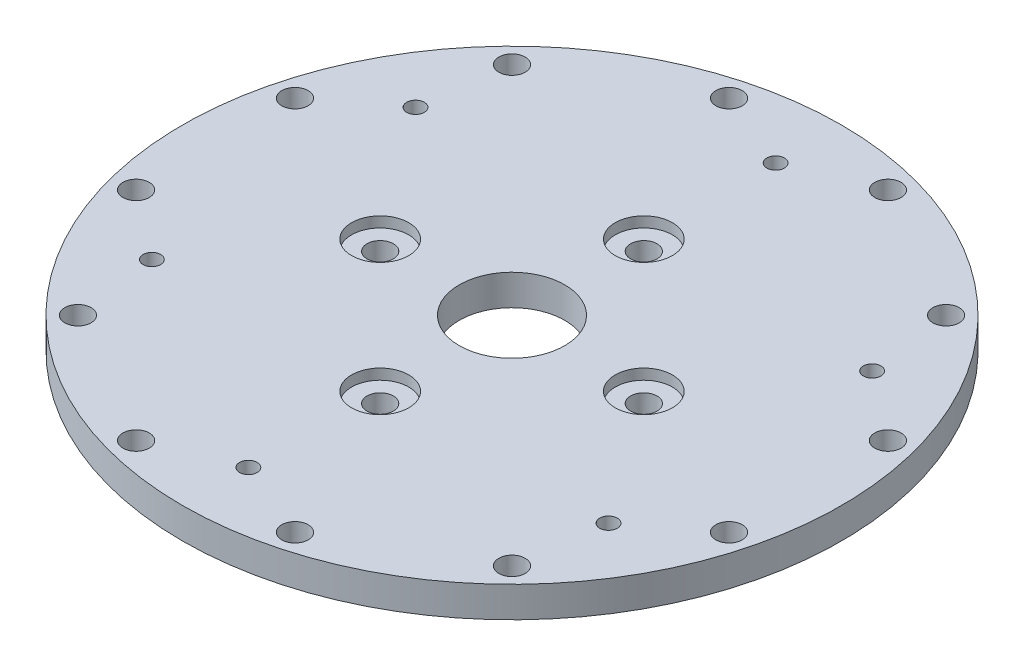
ISO-10303-21;
HEADER;
FILE_DESCRIPTION(('STEP AP214'),'2;1');
FILE_NAME('part.step','',(''),(''),'','','');
FILE_SCHEMA(('AUTOMOTIVE_DESIGN { 1 0 10303 214 1 1 1 1 }'));
ENDSEC;
DATA;
#1=APPLICATION_CONTEXT('core data for automotive mechanical design processes');
#2=APPLICATION_PROTOCOL_DEFINITION('international standard','automotive_design',2000,#1);
#3=PRODUCT_CONTEXT('',#1,'mechanical');
#4=PRODUCT('Part','Part','',(#3));
#5=PRODUCT_RELATED_PRODUCT_CATEGORY('part','',(#4));
#6=PRODUCT_DEFINITION_FORMATION('','',#4);
#7=PRODUCT_DEFINITION_CONTEXT('part definition',#1,'design');
#8=PRODUCT_DEFINITION('design','',#6,#7);
#9=PRODUCT_DEFINITION_SHAPE('','',#8);
#10=(LENGTH_UNIT() NAMED_UNIT(*) SI_UNIT(.MILLI.,.METRE.));
#11=(NAMED_UNIT(*) PLANE_ANGLE_UNIT() SI_UNIT($,.RADIAN.));
#12=(NAMED_UNIT(*) SI_UNIT($,.STERADIAN.) SOLID_ANGLE_UNIT());
#13=UNCERTAINTY_MEASURE_WITH_UNIT(LENGTH_MEASURE(1.E-05),#10,'distance_accuracy_value','');
#14=(GEOMETRIC_REPRESENTATION_CONTEXT(3) GLOBAL_UNCERTAINTY_ASSIGNED_CONTEXT((#13)) GLOBAL_UNIT_ASSIGNED_CONTEXT((#10,
#11,#12)) REPRESENTATION_CONTEXT('',''));
#15=CARTESIAN_POINT('',(0.,0.,0.));
#16=DIRECTION('',(0.,0.,1.));
#17=DIRECTION('',(1.,0.,0.));
#18=AXIS2_PLACEMENT_3D('',#15,#16,#17);
#19=CARTESIAN_POINT('',(0.,3.5,-14.9999999999999));
#20=DIRECTION('',(0.,-1.,0.));
#21=DIRECTION('',(0.,0.,-1.));
#22=AXIS2_PLACEMENT_3D('',#19,#20,#21);
#23=CYLINDRICAL_SURFACE('',#22,1.5);
#24=CARTESIAN_POINT('',(0.,0.,-14.9999999999999));
#25=DIRECTION('',(0.,1.,0.));
#26=DIRECTION('',(0.,0.,1.));
#27=AXIS2_PLACEMENT_3D('',#24,#25,#26);
#28=CIRCLE('',#27,1.5);
#29=CARTESIAN_POINT('',(0.,0.,-13.4999999999999));
#30=VERTEX_POINT('',#29);
#31=EDGE_CURVE('E184',#30,#30,#28,.T.);
#32=ORIENTED_EDGE('',*,*,#31,.F.);
#33=EDGE_LOOP('',(#32));
#34=FACE_BOUND('',#33,.T.);
#35=CARTESIAN_POINT('',(0.,2.3,-14.9999999999999));
#36=DIRECTION('',(0.,1.,0.));
#37=DIRECTION('',(0.,0.,1.));
#38=AXIS2_PLACEMENT_3D('',#35,#36,#37);
#39=CIRCLE('',#38,1.5);
#40=CARTESIAN_POINT('',(0.,2.3,-13.4999999999999));
#41=VERTEX_POINT('',#40);
#42=EDGE_CURVE('E35',#41,#41,#39,.T.);
#43=ORIENTED_EDGE('',*,*,#42,.T.);
#44=EDGE_LOOP('',(#43));
#45=FACE_BOUND('',#44,.T.);
#46=ADVANCED_FACE('F31',(#34,#45),#23,.F.);
#47=CARTESIAN_POINT('',(15.0000000000004,3.5,-5.21223548286541E-13));
#48=DIRECTION('',(0.,-1.,0.));
#49=DIRECTION('',(0.,0.,-1.));
#50=AXIS2_PLACEMENT_3D('',#47,#48,#49);
#51=CYLINDRICAL_SURFACE('',#50,1.5);
#52=CARTESIAN_POINT('',(15.0000000000004,0.,-5.21223548286541E-13));
#53=DIRECTION('',(0.,1.,0.));
#54=DIRECTION('',(0.,0.,1.));
#55=AXIS2_PLACEMENT_3D('',#52,#53,#54);
#56=CIRCLE('',#55,1.5);
#57=CARTESIAN_POINT('',(15.0000000000004,0.,1.49999999999948));
#58=VERTEX_POINT('',#57);
#59=EDGE_CURVE('E181',#58,#58,#56,.T.);
#60=ORIENTED_EDGE('',*,*,#59,.F.);
#61=EDGE_LOOP('',(#60));
#62=FACE_BOUND('',#61,.T.);
#63=CARTESIAN_POINT('',(15.0000000000004,2.3,-5.21223548286541E-13));
#64=DIRECTION('',(0.,1.,0.));
#65=DIRECTION('',(0.,0.,1.));
#66=AXIS2_PLACEMENT_3D('',#63,#64,#65);
#67=CIRCLE('',#66,1.5);
#68=CARTESIAN_POINT('',(15.0000000000004,2.3,1.49999999999948));
#69=VERTEX_POINT('',#68);
#70=EDGE_CURVE('E56',#69,#69,#67,.T.);
#71=ORIENTED_EDGE('',*,*,#70,.T.);
#72=EDGE_LOOP('',(#71));
#73=FACE_BOUND('',#72,.T.);
#74=ADVANCED_FACE('F210',(#62,#73),#51,.F.);
#75=CARTESIAN_POINT('',(9.84833787313913E-13,3.5,14.9999999999999));
#76=DIRECTION('',(0.,-1.,0.));
#77=DIRECTION('',(0.,0.,-1.));
#78=AXIS2_PLACEMENT_3D('',#75,#76,#77);
#79=CYLINDRICAL_SURFACE('',#78,1.5);
#80=CARTESIAN_POINT('',(9.84833787313913E-13,0.,14.9999999999999));
#81=DIRECTION('',(0.,1.,0.));
#82=DIRECTION('',(0.,0.,1.));
#83=AXIS2_PLACEMENT_3D('',#80,#81,#82);
#84=CIRCLE('',#83,1.5);
#85=CARTESIAN_POINT('',(9.84833787313913E-13,0.,16.4999999999999));
#86=VERTEX_POINT('',#85);
#87=EDGE_CURVE('E178',#86,#86,#84,.T.);
#88=ORIENTED_EDGE('',*,*,#87,.F.);
#89=EDGE_LOOP('',(#88));
#90=FACE_BOUND('',#89,.T.);
#91=CARTESIAN_POINT('',(9.84833787313913E-13,2.3,14.9999999999999));
#92=DIRECTION('',(0.,1.,0.));
#93=DIRECTION('',(0.,0.,1.));
#94=AXIS2_PLACEMENT_3D('',#91,#92,#93);
#95=CIRCLE('',#94,1.5);
#96=CARTESIAN_POINT('',(9.84833787313913E-13,2.3,16.4999999999999));
#97=VERTEX_POINT('',#96);
#98=EDGE_CURVE('E53',#97,#97,#95,.T.);
#99=ORIENTED_EDGE('',*,*,#98,.T.);
#100=EDGE_LOOP('',(#99));
#101=FACE_BOUND('',#100,.T.);
#102=ADVANCED_FACE('F215',(#90,#101),#79,.F.);
#103=CARTESIAN_POINT('',(-14.9999999999994,3.5,5.23060518485262E-13));
#104=DIRECTION('',(0.,-1.,0.));
#105=DIRECTION('',(0.,0.,-1.));
#106=AXIS2_PLACEMENT_3D('',#103,#104,#105);
#107=CYLINDRICAL_SURFACE('',#106,1.5);
#108=CARTESIAN_POINT('',(-14.9999999999994,0.,5.23060518485262E-13));
#109=DIRECTION('',(0.,1.,0.));
#110=DIRECTION('',(0.,0.,1.));
#111=AXIS2_PLACEMENT_3D('',#108,#109,#110);
#112=CIRCLE('',#111,1.5);
#113=CARTESIAN_POINT('',(-14.9999999999994,0.,1.50000000000052));
#114=VERTEX_POINT('',#113);
#115=EDGE_CURVE('E173',#114,#114,#112,.T.);
#116=ORIENTED_EDGE('',*,*,#115,.F.);
#117=EDGE_LOOP('',(#116));
#118=FACE_BOUND('',#117,.T.);
#119=CARTESIAN_POINT('',(-14.9999999999994,2.3,5.23060518485262E-13));
#120=DIRECTION('',(0.,1.,0.));
#121=DIRECTION('',(0.,0.,1.));
#122=AXIS2_PLACEMENT_3D('',#119,#120,#121);
#123=CIRCLE('',#122,1.5);
#124=CARTESIAN_POINT('',(-14.9999999999994,2.3,1.50000000000052));
#125=VERTEX_POINT('',#124);
#126=EDGE_CURVE('E50',#125,#125,#123,.T.);
#127=ORIENTED_EDGE('',*,*,#126,.T.);
#128=EDGE_LOOP('',(#127));
#129=FACE_BOUND('',#128,.T.);
#130=ADVANCED_FACE('F222',(#118,#129),#107,.F.);
#131=CARTESIAN_POINT('',(0.,3.5,0.));
#132=DIRECTION('',(0.,1.,0.));
#133=DIRECTION('',(0.,0.,1.));
#134=AXIS2_PLACEMENT_3D('',#131,#132,#133);
#135=PLANE('',#134);
#136=CARTESIAN_POINT('',(0.,3.5,-15.0000000000004));
#137=DIRECTION('',(0.,1.,0.));
#138=DIRECTION('',(0.,0.,1.));
#139=AXIS2_PLACEMENT_3D('',#136,#137,#138);
#140=CIRCLE('',#139,3.25);
#141=CARTESIAN_POINT('',(0.,3.5,-11.7500000000004));
#142=VERTEX_POINT('',#141);
#143=EDGE_CURVE('E331',#142,#142,#140,.T.);
#144=ORIENTED_EDGE('',*,*,#143,.F.);
#145=EDGE_LOOP('',(#144));
#146=FACE_BOUND('',#145,.T.);
#147=CARTESIAN_POINT('',(15.0000000000008,3.5,-4.23570186157989E-13));
#148=DIRECTION('',(0.,1.,0.));
#149=DIRECTION('',(0.,0.,1.));
#150=AXIS2_PLACEMENT_3D('',#147,#148,#149);
#151=CIRCLE('',#150,3.25);
#152=CARTESIAN_POINT('',(15.0000000000008,3.5,3.24999999999958));
#153=VERTEX_POINT('',#152);
#154=EDGE_CURVE('E339',#153,#153,#151,.T.);
#155=ORIENTED_EDGE('',*,*,#154,.F.);
#156=EDGE_LOOP('',(#155));
#157=FACE_BOUND('',#156,.T.);
#158=CARTESIAN_POINT('',(8.47140372315977E-13,3.5,15.0000000000004));
#159=DIRECTION('',(0.,1.,0.));
#160=DIRECTION('',(0.,0.,1.));
#161=AXIS2_PLACEMENT_3D('',#158,#159,#160);
#162=CIRCLE('',#161,3.25);
#163=CARTESIAN_POINT('',(8.47140372315977E-13,3.5,18.2500000000004));
#164=VERTEX_POINT('',#163);
#165=EDGE_CURVE('E345',#164,#164,#162,.T.);
#166=ORIENTED_EDGE('',*,*,#165,.F.);
#167=EDGE_LOOP('',(#166));
#168=FACE_BOUND('',#167,.T.);
#169=CARTESIAN_POINT('',(-14.9999999999999,3.5,4.2540715635671E-13));
#170=DIRECTION('',(0.,1.,0.));
#171=DIRECTION('',(0.,0.,1.));
#172=AXIS2_PLACEMENT_3D('',#169,#170,#171);
#173=CIRCLE('',#172,3.25);
#174=CARTESIAN_POINT('',(-14.9999999999999,3.5,3.25000000000043));
#175=VERTEX_POINT('',#174);
#176=EDGE_CURVE('E350',#175,#175,#173,.T.);
#177=ORIENTED_EDGE('',*,*,#176,.F.);
#178=EDGE_LOOP('',(#177));
#179=FACE_BOUND('',#178,.T.);
#180=CARTESIAN_POINT('',(-25.9807621135312,3.5,15.0000000000011));
#181=DIRECTION('',(0.,1.,0.));
#182=DIRECTION('',(0.,0.,1.));
#183=AXIS2_PLACEMENT_3D('',#180,#181,#182);
#184=CIRCLE('',#183,1.00000000000243);
#185=CARTESIAN_POINT('',(-25.9807621135312,3.5,16.0000000000035));
#186=VERTEX_POINT('',#185);
#187=EDGE_CURVE('E74',#186,#186,#184,.T.);
#188=ORIENTED_EDGE('',*,*,#187,.F.);
#189=EDGE_LOOP('',(#188));
#190=FACE_BOUND('',#189,.T.);
#191=CARTESIAN_POINT('',(25.9807621135351,3.5,14.9999999999989));
#192=DIRECTION('',(0.,1.,0.));
#193=DIRECTION('',(0.,0.,1.));
#194=AXIS2_PLACEMENT_3D('',#191,#192,#193);
#195=CIRCLE('',#194,1.00000000000165);
#196=CARTESIAN_POINT('',(25.9807621135351,3.5,16.0000000000005));
#197=VERTEX_POINT('',#196);
#198=EDGE_CURVE('E86',#197,#197,#195,.T.);
#199=ORIENTED_EDGE('',*,*,#198,.F.);
#200=EDGE_LOOP('',(#199));
#201=FACE_BOUND('',#200,.T.);
#202=CARTESIAN_POINT('',(-24.6972276961999,3.5,24.697227696199));
#203=DIRECTION('',(0.,1.,0.));
#204=DIRECTION('',(0.,0.,1.));
#205=AXIS2_PLACEMENT_3D('',#202,#203,#204);
#206=CIRCLE('',#205,1.50000000000001);
#207=CARTESIAN_POINT('',(-24.6972276961999,3.5,26.197227696199));
#208=VERTEX_POINT('',#207);
#209=EDGE_CURVE('E98',#208,#208,#206,.T.);
#210=ORIENTED_EDGE('',*,*,#209,.F.);
#211=EDGE_LOOP('',(#210));
#212=FACE_BOUND('',#211,.T.);
#213=CARTESIAN_POINT('',(9.03981273985704,3.5,33.7370404360572));
#214=DIRECTION('',(0.,1.,0.));
#215=DIRECTION('',(0.,0.,1.));
#216=AXIS2_PLACEMENT_3D('',#213,#214,#215);
#217=CIRCLE('',#216,1.50000000000001);
#218=CARTESIAN_POINT('',(9.03981273985704,3.5,35.2370404360572));
#219=VERTEX_POINT('',#218);
#220=EDGE_CURVE('E110',#219,#219,#217,.T.);
#221=ORIENTED_EDGE('',*,*,#220,.F.);
#222=EDGE_LOOP('',(#221));
#223=FACE_BOUND('',#222,.T.);
#224=CARTESIAN_POINT('',(33.7370404360569,3.5,9.03981273985811));
#225=DIRECTION('',(0.,1.,0.));
#226=DIRECTION('',(0.,0.,1.));
#227=AXIS2_PLACEMENT_3D('',#224,#225,#226);
#228=CIRCLE('',#227,1.5);
#229=CARTESIAN_POINT('',(33.7370404360569,3.5,10.5398127398581));
#230=VERTEX_POINT('',#229);
#231=EDGE_CURVE('E122',#230,#230,#228,.T.);
#232=ORIENTED_EDGE('',*,*,#231,.F.);
#233=EDGE_LOOP('',(#232));
#234=FACE_BOUND('',#233,.T.);
#235=CARTESIAN_POINT('',(24.6972276961997,3.5,-24.6972276961991));
#236=DIRECTION('',(0.,1.,0.));
#237=DIRECTION('',(0.,0.,1.));
#238=AXIS2_PLACEMENT_3D('',#235,#236,#237);
#239=CIRCLE('',#238,1.50000000000001);
#240=CARTESIAN_POINT('',(24.6972276961997,3.5,-23.1972276961991));
#241=VERTEX_POINT('',#240);
#242=EDGE_CURVE('E134',#241,#241,#239,.T.);
#243=ORIENTED_EDGE('',*,*,#242,.F.);
#244=EDGE_LOOP('',(#243));
#245=FACE_BOUND('',#244,.T.);
#246=CARTESIAN_POINT('',(-9.03981273985728,3.5,-33.7370404360571));
#247=DIRECTION('',(0.,1.,0.));
#248=DIRECTION('',(0.,0.,1.));
#249=AXIS2_PLACEMENT_3D('',#246,#247,#248);
#250=CIRCLE('',#249,1.50000000000001);
#251=CARTESIAN_POINT('',(-9.03981273985728,3.5,-32.2370404360571));
#252=VERTEX_POINT('',#251);
#253=EDGE_CURVE('E146',#252,#252,#250,.T.);
#254=ORIENTED_EDGE('',*,*,#253,.F.);
#255=EDGE_LOOP('',(#254));
#256=FACE_BOUND('',#255,.T.);
#257=CARTESIAN_POINT('',(-33.737040436057,3.5,-9.03981273985787));
#258=DIRECTION('',(0.,1.,0.));
#259=DIRECTION('',(0.,0.,1.));
#260=AXIS2_PLACEMENT_3D('',#257,#258,#259);
#261=CIRCLE('',#260,1.50000000000001);
#262=CARTESIAN_POINT('',(-33.737040436057,3.5,-7.53981273985786));
#263=VERTEX_POINT('',#262);
#264=EDGE_CURVE('E158',#263,#263,#261,.T.);
#265=ORIENTED_EDGE('',*,*,#264,.F.);
#266=EDGE_LOOP('',(#265));
#267=FACE_BOUND('',#266,.T.);
#268=CARTESIAN_POINT('',(-33.7370404360571,3.5,9.0398127398574));
#269=DIRECTION('',(0.,1.,0.));
#270=DIRECTION('',(0.,0.,1.));
#271=AXIS2_PLACEMENT_3D('',#268,#269,#270);
#272=CIRCLE('',#271,1.5);
#273=CARTESIAN_POINT('',(-33.7370404360571,3.5,10.5398127398574));
#274=VERTEX_POINT('',#273);
#275=EDGE_CURVE('E170',#274,#274,#272,.T.);
#276=ORIENTED_EDGE('',*,*,#275,.F.);
#277=EDGE_LOOP('',(#276));
#278=FACE_BOUND('',#277,.T.);
#279=CARTESIAN_POINT('',(0.,3.5,0.));
#280=DIRECTION('',(0.,1.,0.));
#281=DIRECTION('',(0.,0.,1.));
#282=AXIS2_PLACEMENT_3D('',#279,#280,#281);
#283=CIRCLE('',#282,37.5);
#284=CARTESIAN_POINT('',(0.,3.5,37.5));
#285=VERTEX_POINT('',#284);
#286=EDGE_CURVE('E10',#285,#285,#283,.T.);
#287=ORIENTED_EDGE('',*,*,#286,.T.);
#288=EDGE_LOOP('',(#287));
#289=FACE_BOUND('',#288,.T.);
#290=CARTESIAN_POINT('',(0.,3.5,0.));
#291=DIRECTION('',(0.,1.,0.));
#292=DIRECTION('',(0.,0.,1.));
#293=AXIS2_PLACEMENT_3D('',#290,#291,#292);
#294=CIRCLE('',#293,6.);
#295=CARTESIAN_POINT('',(0.,3.5,6.));
#296=VERTEX_POINT('',#295);
#297=EDGE_CURVE('E44',#296,#296,#294,.T.);
#298=ORIENTED_EDGE('',*,*,#297,.F.);
#299=EDGE_LOOP('',(#298));
#300=FACE_BOUND('',#299,.T.);
#301=CARTESIAN_POINT('',(0.,3.5,-30.));
#302=DIRECTION('',(0.,1.,0.));
#303=DIRECTION('',(0.,0.,1.));
#304=AXIS2_PLACEMENT_3D('',#301,#302,#303);
#305=CIRCLE('',#304,1.);
#306=CARTESIAN_POINT('',(0.,3.5,-29.));
#307=VERTEX_POINT('',#306);
#308=EDGE_CURVE('E164',#307,#307,#305,.T.);
#309=ORIENTED_EDGE('',*,*,#308,.F.);
#310=EDGE_LOOP('',(#309));
#311=FACE_BOUND('',#310,.T.);
#312=CARTESIAN_POINT('',(-24.6972276961992,3.5,-24.6972276961996));
#313=DIRECTION('',(0.,1.,0.));
#314=DIRECTION('',(0.,0.,1.));
#315=AXIS2_PLACEMENT_3D('',#312,#313,#314);
#316=CIRCLE('',#315,1.5);
#317=CARTESIAN_POINT('',(-24.6972276961992,3.5,-23.1972276961996));
#318=VERTEX_POINT('',#317);
#319=EDGE_CURVE('E152',#318,#318,#316,.T.);
#320=ORIENTED_EDGE('',*,*,#319,.F.);
#321=EDGE_LOOP('',(#320));
#322=FACE_BOUND('',#321,.T.);
#323=CARTESIAN_POINT('',(9.03981273985798,3.5,-33.7370404360569));
#324=DIRECTION('',(0.,1.,0.));
#325=DIRECTION('',(0.,0.,1.));
#326=AXIS2_PLACEMENT_3D('',#323,#324,#325);
#327=CIRCLE('',#326,1.5);
#328=CARTESIAN_POINT('',(9.03981273985798,3.5,-32.2370404360569));
#329=VERTEX_POINT('',#328);
#330=EDGE_CURVE('E140',#329,#329,#327,.T.);
#331=ORIENTED_EDGE('',*,*,#330,.F.);
#332=EDGE_LOOP('',(#331));
#333=FACE_BOUND('',#332,.T.);
#334=CARTESIAN_POINT('',(33.7370404360572,3.5,-9.03981273985717));
#335=DIRECTION('',(0.,1.,0.));
#336=DIRECTION('',(0.,0.,1.));
#337=AXIS2_PLACEMENT_3D('',#334,#335,#336);
#338=CIRCLE('',#337,1.5);
#339=CARTESIAN_POINT('',(33.7370404360572,3.5,-7.53981273985716));
#340=VERTEX_POINT('',#339);
#341=EDGE_CURVE('E128',#340,#340,#338,.T.);
#342=ORIENTED_EDGE('',*,*,#341,.F.);
#343=EDGE_LOOP('',(#342));
#344=FACE_BOUND('',#343,.T.);
#345=CARTESIAN_POINT('',(24.697227696199,3.5,24.6972276961998));
#346=DIRECTION('',(0.,1.,0.));
#347=DIRECTION('',(0.,0.,1.));
#348=AXIS2_PLACEMENT_3D('',#345,#346,#347);
#349=CIRCLE('',#348,1.5);
#350=CARTESIAN_POINT('',(24.697227696199,3.5,26.1972276961998));
#351=VERTEX_POINT('',#350);
#352=EDGE_CURVE('E116',#351,#351,#349,.T.);
#353=ORIENTED_EDGE('',*,*,#352,.F.);
#354=EDGE_LOOP('',(#353));
#355=FACE_BOUND('',#354,.T.);
#356=CARTESIAN_POINT('',(-9.03981273985821,3.5,33.7370404360569));
#357=DIRECTION('',(0.,1.,0.));
#358=DIRECTION('',(0.,0.,1.));
#359=AXIS2_PLACEMENT_3D('',#356,#357,#358);
#360=CIRCLE('',#359,1.5);
#361=CARTESIAN_POINT('',(-9.03981273985821,3.5,35.2370404360569));
#362=VERTEX_POINT('',#361);
#363=EDGE_CURVE('E104',#362,#362,#360,.T.);
#364=ORIENTED_EDGE('',*,*,#363,.F.);
#365=EDGE_LOOP('',(#364));
#366=FACE_BOUND('',#365,.T.);
#367=CARTESIAN_POINT('',(25.9807621135338,3.5,-15.0000000000011));
#368=DIRECTION('',(0.,1.,0.));
#369=DIRECTION('',(0.,0.,1.));
#370=AXIS2_PLACEMENT_3D('',#367,#368,#369);
#371=CIRCLE('',#370,1.00000000000036);
#372=CARTESIAN_POINT('',(25.9807621135338,3.5,-14.0000000000007));
#373=VERTEX_POINT('',#372);
#374=EDGE_CURVE('E92',#373,#373,#371,.T.);
#375=ORIENTED_EDGE('',*,*,#374,.F.);
#376=EDGE_LOOP('',(#375));
#377=FACE_BOUND('',#376,.T.);
#378=CARTESIAN_POINT('',(2.54693202754403E-12,3.5,30.));
#379=DIRECTION('',(0.,1.,0.));
#380=DIRECTION('',(0.,0.,1.));
#381=AXIS2_PLACEMENT_3D('',#378,#379,#380);
#382=CIRCLE('',#381,1.00000000000264);
#383=CARTESIAN_POINT('',(2.54693202754403E-12,3.5,31.0000000000026));
#384=VERTEX_POINT('',#383);
#385=EDGE_CURVE('E80',#384,#384,#382,.T.);
#386=ORIENTED_EDGE('',*,*,#385,.F.);
#387=EDGE_LOOP('',(#386));
#388=FACE_BOUND('',#387,.T.);
#389=CARTESIAN_POINT('',(-25.9807621135325,3.5,-14.9999999999989));
#390=DIRECTION('',(0.,1.,0.));
#391=DIRECTION('',(0.,0.,1.));
#392=AXIS2_PLACEMENT_3D('',#389,#390,#391);
#393=CIRCLE('',#392,1.00000000000129);
#394=CARTESIAN_POINT('',(-25.9807621135325,3.5,-13.9999999999976));
#395=VERTEX_POINT('',#394);
#396=EDGE_CURVE('E65',#395,#395,#393,.T.);
#397=ORIENTED_EDGE('',*,*,#396,.F.);
#398=EDGE_LOOP('',(#397));
#399=FACE_BOUND('',#398,.T.);
#400=ADVANCED_FACE('F225',(#146,#157,#168,#179,#190,#201,#212,#223,#234,#245,#256,#267,#278,
#289,#300,#311,#322,#333,#344,#355,#366,#377,#388,#399),#135,.T.);
#401=CARTESIAN_POINT('',(0.,0.,0.));
#402=DIRECTION('',(0.,1.,0.));
#403=DIRECTION('',(0.,0.,1.));
#404=AXIS2_PLACEMENT_3D('',#401,#402,#403);
#405=PLANE('',#404);
#406=CARTESIAN_POINT('',(0.,0.,0.));
#407=DIRECTION('',(0.,1.,0.));
#408=DIRECTION('',(0.,0.,1.));
#409=AXIS2_PLACEMENT_3D('',#406,#407,#408);
#410=CIRCLE('',#409,37.5);
#411=CARTESIAN_POINT('',(0.,0.,37.5));
#412=VERTEX_POINT('',#411);
#413=EDGE_CURVE('E39',#412,#412,#410,.T.);
#414=ORIENTED_EDGE('',*,*,#413,.F.);
#415=EDGE_LOOP('',(#414));
#416=FACE_BOUND('',#415,.T.);
#417=CARTESIAN_POINT('',(0.,0.,0.));
#418=DIRECTION('',(0.,1.,0.));
#419=DIRECTION('',(0.,0.,1.));
#420=AXIS2_PLACEMENT_3D('',#417,#418,#419);
#421=CIRCLE('',#420,6.);
#422=CARTESIAN_POINT('',(0.,0.,6.));
#423=VERTEX_POINT('',#422);
#424=EDGE_CURVE('E47',#423,#423,#421,.T.);
#425=ORIENTED_EDGE('',*,*,#424,.T.);
#426=EDGE_LOOP('',(#425));
#427=FACE_BOUND('',#426,.T.);
#428=ORIENTED_EDGE('',*,*,#31,.T.);
#429=EDGE_LOOP('',(#428));
#430=FACE_BOUND('',#429,.T.);
#431=ORIENTED_EDGE('',*,*,#59,.T.);
#432=EDGE_LOOP('',(#431));
#433=FACE_BOUND('',#432,.T.);
#434=ORIENTED_EDGE('',*,*,#87,.T.);
#435=EDGE_LOOP('',(#434));
#436=FACE_BOUND('',#435,.T.);
#437=ORIENTED_EDGE('',*,*,#115,.T.);
#438=EDGE_LOOP('',(#437));
#439=FACE_BOUND('',#438,.T.);
#440=CARTESIAN_POINT('',(-33.7370404360571,0.,9.0398127398574));
#441=DIRECTION('',(0.,1.,0.));
#442=DIRECTION('',(0.,0.,1.));
#443=AXIS2_PLACEMENT_3D('',#440,#441,#442);
#444=CIRCLE('',#443,1.5);
#445=CARTESIAN_POINT('',(-33.7370404360571,0.,10.5398127398574));
#446=VERTEX_POINT('',#445);
#447=EDGE_CURVE('E167',#446,#446,#444,.T.);
#448=ORIENTED_EDGE('',*,*,#447,.T.);
#449=EDGE_LOOP('',(#448));
#450=FACE_BOUND('',#449,.T.);
#451=CARTESIAN_POINT('',(0.,0.,-30.));
#452=DIRECTION('',(0.,1.,0.));
#453=DIRECTION('',(0.,0.,1.));
#454=AXIS2_PLACEMENT_3D('',#451,#452,#453);
#455=CIRCLE('',#454,1.);
#456=CARTESIAN_POINT('',(0.,0.,-29.));
#457=VERTEX_POINT('',#456);
#458=EDGE_CURVE('E161',#457,#457,#455,.T.);
#459=ORIENTED_EDGE('',*,*,#458,.T.);
#460=EDGE_LOOP('',(#459));
#461=FACE_BOUND('',#460,.T.);
#462=CARTESIAN_POINT('',(-33.737040436057,0.,-9.03981273985787));
#463=DIRECTION('',(0.,1.,0.));
#464=DIRECTION('',(0.,0.,1.));
#465=AXIS2_PLACEMENT_3D('',#462,#463,#464);
#466=CIRCLE('',#465,1.50000000000001);
#467=CARTESIAN_POINT('',(-33.737040436057,0.,-7.53981273985786));
#468=VERTEX_POINT('',#467);
#469=EDGE_CURVE('E155',#468,#468,#466,.T.);
#470=ORIENTED_EDGE('',*,*,#469,.T.);
#471=EDGE_LOOP('',(#470));
#472=FACE_BOUND('',#471,.T.);
#473=CARTESIAN_POINT('',(-24.6972276961992,0.,-24.6972276961996));
#474=DIRECTION('',(0.,1.,0.));
#475=DIRECTION('',(0.,0.,1.));
#476=AXIS2_PLACEMENT_3D('',#473,#474,#475);
#477=CIRCLE('',#476,1.5);
#478=CARTESIAN_POINT('',(-24.6972276961992,0.,-23.1972276961996));
#479=VERTEX_POINT('',#478);
#480=EDGE_CURVE('E149',#479,#479,#477,.T.);
#481=ORIENTED_EDGE('',*,*,#480,.T.);
#482=EDGE_LOOP('',(#481));
#483=FACE_BOUND('',#482,.T.);
#484=CARTESIAN_POINT('',(-9.03981273985728,0.,-33.7370404360571));
#485=DIRECTION('',(0.,1.,0.));
#486=DIRECTION('',(0.,0.,1.));
#487=AXIS2_PLACEMENT_3D('',#484,#485,#486);
#488=CIRCLE('',#487,1.50000000000001);
#489=CARTESIAN_POINT('',(-9.03981273985728,0.,-32.2370404360571));
#490=VERTEX_POINT('',#489);
#491=EDGE_CURVE('E143',#490,#490,#488,.T.);
#492=ORIENTED_EDGE('',*,*,#491,.T.);
#493=EDGE_LOOP('',(#492));
#494=FACE_BOUND('',#493,.T.);
#495=CARTESIAN_POINT('',(9.03981273985798,0.,-33.7370404360569));
#496=DIRECTION('',(0.,1.,0.));
#497=DIRECTION('',(0.,0.,1.));
#498=AXIS2_PLACEMENT_3D('',#495,#496,#497);
#499=CIRCLE('',#498,1.5);
#500=CARTESIAN_POINT('',(9.03981273985798,0.,-32.2370404360569));
#501=VERTEX_POINT('',#500);
#502=EDGE_CURVE('E137',#501,#501,#499,.T.);
#503=ORIENTED_EDGE('',*,*,#502,.T.);
#504=EDGE_LOOP('',(#503));
#505=FACE_BOUND('',#504,.T.);
#506=CARTESIAN_POINT('',(24.6972276961997,0.,-24.6972276961991));
#507=DIRECTION('',(0.,1.,0.));
#508=DIRECTION('',(0.,0.,1.));
#509=AXIS2_PLACEMENT_3D('',#506,#507,#508);
#510=CIRCLE('',#509,1.50000000000001);
#511=CARTESIAN_POINT('',(24.6972276961997,0.,-23.1972276961991));
#512=VERTEX_POINT('',#511);
#513=EDGE_CURVE('E131',#512,#512,#510,.T.);
#514=ORIENTED_EDGE('',*,*,#513,.T.);
#515=EDGE_LOOP('',(#514));
#516=FACE_BOUND('',#515,.T.);
#517=CARTESIAN_POINT('',(33.7370404360572,0.,-9.03981273985717));
#518=DIRECTION('',(0.,1.,0.));
#519=DIRECTION('',(0.,0.,1.));
#520=AXIS2_PLACEMENT_3D('',#517,#518,#519);
#521=CIRCLE('',#520,1.5);
#522=CARTESIAN_POINT('',(33.7370404360572,0.,-7.53981273985716));
#523=VERTEX_POINT('',#522);
#524=EDGE_CURVE('E125',#523,#523,#521,.T.);
#525=ORIENTED_EDGE('',*,*,#524,.T.);
#526=EDGE_LOOP('',(#525));
#527=FACE_BOUND('',#526,.T.);
#528=CARTESIAN_POINT('',(33.7370404360569,0.,9.03981273985811));
#529=DIRECTION('',(0.,1.,0.));
#530=DIRECTION('',(0.,0.,1.));
#531=AXIS2_PLACEMENT_3D('',#528,#529,#530);
#532=CIRCLE('',#531,1.5);
#533=CARTESIAN_POINT('',(33.7370404360569,0.,10.5398127398581));
#534=VERTEX_POINT('',#533);
#535=EDGE_CURVE('E119',#534,#534,#532,.T.);
#536=ORIENTED_EDGE('',*,*,#535,.T.);
#537=EDGE_LOOP('',(#536));
#538=FACE_BOUND('',#537,.T.);
#539=CARTESIAN_POINT('',(24.697227696199,0.,24.6972276961998));
#540=DIRECTION('',(0.,1.,0.));
#541=DIRECTION('',(0.,0.,1.));
#542=AXIS2_PLACEMENT_3D('',#539,#540,#541);
#543=CIRCLE('',#542,1.5);
#544=CARTESIAN_POINT('',(24.697227696199,0.,26.1972276961998));
#545=VERTEX_POINT('',#544);
#546=EDGE_CURVE('E113',#545,#545,#543,.T.);
#547=ORIENTED_EDGE('',*,*,#546,.T.);
#548=EDGE_LOOP('',(#547));
#549=FACE_BOUND('',#548,.T.);
#550=CARTESIAN_POINT('',(9.03981273985704,0.,33.7370404360572));
#551=DIRECTION('',(0.,1.,0.));
#552=DIRECTION('',(0.,0.,1.));
#553=AXIS2_PLACEMENT_3D('',#550,#551,#552);
#554=CIRCLE('',#553,1.50000000000001);
#555=CARTESIAN_POINT('',(9.03981273985704,0.,35.2370404360572));
#556=VERTEX_POINT('',#555);
#557=EDGE_CURVE('E107',#556,#556,#554,.T.);
#558=ORIENTED_EDGE('',*,*,#557,.T.);
#559=EDGE_LOOP('',(#558));
#560=FACE_BOUND('',#559,.T.);
#561=CARTESIAN_POINT('',(-9.03981273985821,0.,33.7370404360569));
#562=DIRECTION('',(0.,1.,0.));
#563=DIRECTION('',(0.,0.,1.));
#564=AXIS2_PLACEMENT_3D('',#561,#562,#563);
#565=CIRCLE('',#564,1.5);
#566=CARTESIAN_POINT('',(-9.03981273985821,0.,35.2370404360569));
#567=VERTEX_POINT('',#566);
#568=EDGE_CURVE('E101',#567,#567,#565,.T.);
#569=ORIENTED_EDGE('',*,*,#568,.T.);
#570=EDGE_LOOP('',(#569));
#571=FACE_BOUND('',#570,.T.);
#572=CARTESIAN_POINT('',(-24.6972276961999,0.,24.697227696199));
#573=DIRECTION('',(0.,1.,0.));
#574=DIRECTION('',(0.,0.,1.));
#575=AXIS2_PLACEMENT_3D('',#572,#573,#574);
#576=CIRCLE('',#575,1.50000000000001);
#577=CARTESIAN_POINT('',(-24.6972276961999,0.,26.197227696199));
#578=VERTEX_POINT('',#577);
#579=EDGE_CURVE('E95',#578,#578,#576,.T.);
#580=ORIENTED_EDGE('',*,*,#579,.T.);
#581=EDGE_LOOP('',(#580));
#582=FACE_BOUND('',#581,.T.);
#583=CARTESIAN_POINT('',(25.9807621135338,0.,-15.0000000000011));
#584=DIRECTION('',(0.,1.,0.));
#585=DIRECTION('',(0.,0.,1.));
#586=AXIS2_PLACEMENT_3D('',#583,#584,#585);
#587=CIRCLE('',#586,1.00000000000036);
#588=CARTESIAN_POINT('',(25.9807621135338,0.,-14.0000000000007));
#589=VERTEX_POINT('',#588);
#590=EDGE_CURVE('E89',#589,#589,#587,.T.);
#591=ORIENTED_EDGE('',*,*,#590,.T.);
#592=EDGE_LOOP('',(#591));
#593=FACE_BOUND('',#592,.T.);
#594=CARTESIAN_POINT('',(25.9807621135351,0.,14.9999999999989));
#595=DIRECTION('',(0.,1.,0.));
#596=DIRECTION('',(0.,0.,1.));
#597=AXIS2_PLACEMENT_3D('',#594,#595,#596);
#598=CIRCLE('',#597,1.00000000000165);
#599=CARTESIAN_POINT('',(25.9807621135351,0.,16.0000000000005));
#600=VERTEX_POINT('',#599);
#601=EDGE_CURVE('E83',#600,#600,#598,.T.);
#602=ORIENTED_EDGE('',*,*,#601,.T.);
#603=EDGE_LOOP('',(#602));
#604=FACE_BOUND('',#603,.T.);
#605=CARTESIAN_POINT('',(2.54693202754403E-12,0.,30.));
#606=DIRECTION('',(0.,1.,0.));
#607=DIRECTION('',(0.,0.,1.));
#608=AXIS2_PLACEMENT_3D('',#605,#606,#607);
#609=CIRCLE('',#608,1.00000000000264);
#610=CARTESIAN_POINT('',(2.54693202754403E-12,0.,31.0000000000026));
#611=VERTEX_POINT('',#610);
#612=EDGE_CURVE('E77',#611,#611,#609,.T.);
#613=ORIENTED_EDGE('',*,*,#612,.T.);
#614=EDGE_LOOP('',(#613));
#615=FACE_BOUND('',#614,.T.);
#616=CARTESIAN_POINT('',(-25.9807621135312,0.,15.0000000000011));
#617=DIRECTION('',(0.,1.,0.));
#618=DIRECTION('',(0.,0.,1.));
#619=AXIS2_PLACEMENT_3D('',#616,#617,#618);
#620=CIRCLE('',#619,1.00000000000243);
#621=CARTESIAN_POINT('',(-25.9807621135312,0.,16.0000000000035));
#622=VERTEX_POINT('',#621);
#623=EDGE_CURVE('E70',#622,#622,#620,.T.);
#624=ORIENTED_EDGE('',*,*,#623,.T.);
#625=EDGE_LOOP('',(#624));
#626=FACE_BOUND('',#625,.T.);
#627=CARTESIAN_POINT('',(-25.9807621135325,0.,-14.9999999999989));
#628=DIRECTION('',(0.,1.,0.));
#629=DIRECTION('',(0.,0.,1.));
#630=AXIS2_PLACEMENT_3D('',#627,#628,#629);
#631=CIRCLE('',#630,1.00000000000129);
#632=CARTESIAN_POINT('',(-25.9807621135325,0.,-13.9999999999976));
#633=VERTEX_POINT('',#632);
#634=EDGE_CURVE('E61',#633,#633,#631,.T.);
#635=ORIENTED_EDGE('',*,*,#634,.T.);
#636=EDGE_LOOP('',(#635));
#637=FACE_BOUND('',#636,.T.);
#638=ADVANCED_FACE('F192',(#416,#427,#430,#433,#436,#439,#450,#461,#472,#483,#494,#505,#516,
#527,#538,#549,#560,#571,#582,#593,#604,#615,#626,#637),#405,.F.);
#639=CARTESIAN_POINT('',(0.,3.5,0.));
#640=DIRECTION('',(0.,-1.,0.));
#641=DIRECTION('',(0.,0.,-1.));
#642=AXIS2_PLACEMENT_3D('',#639,#640,#641);
#643=CYLINDRICAL_SURFACE('',#642,37.5);
#644=ORIENTED_EDGE('',*,*,#286,.F.);
#645=EDGE_LOOP('',(#644));
#646=FACE_BOUND('',#645,.T.);
#647=ORIENTED_EDGE('',*,*,#413,.T.);
#648=EDGE_LOOP('',(#647));
#649=FACE_BOUND('',#648,.T.);
#650=ADVANCED_FACE('F33',(#646,#649),#643,.T.);
#651=CARTESIAN_POINT('',(0.,3.5,0.));
#652=DIRECTION('',(0.,-1.,0.));
#653=DIRECTION('',(0.,0.,-1.));
#654=AXIS2_PLACEMENT_3D('',#651,#652,#653);
#655=CYLINDRICAL_SURFACE('',#654,6.);
#656=ORIENTED_EDGE('',*,*,#297,.T.);
#657=EDGE_LOOP('',(#656));
#658=FACE_BOUND('',#657,.T.);
#659=ORIENTED_EDGE('',*,*,#424,.F.);
#660=EDGE_LOOP('',(#659));
#661=FACE_BOUND('',#660,.T.);
#662=ADVANCED_FACE('F195',(#658,#661),#655,.F.);
#663=CARTESIAN_POINT('',(-33.7370404360571,3.5,9.0398127398574));
#664=DIRECTION('',(0.,-1.,0.));
#665=DIRECTION('',(0.,0.,-1.));
#666=AXIS2_PLACEMENT_3D('',#663,#664,#665);
#667=CYLINDRICAL_SURFACE('',#666,1.5);
#668=ORIENTED_EDGE('',*,*,#275,.T.);
#669=EDGE_LOOP('',(#668));
#670=FACE_BOUND('',#669,.T.);
#671=ORIENTED_EDGE('',*,*,#447,.F.);
#672=EDGE_LOOP('',(#671));
#673=FACE_BOUND('',#672,.T.);
#674=ADVANCED_FACE('F197',(#670,#673),#667,.F.);
#675=CARTESIAN_POINT('',(0.,3.5,-30.));
#676=DIRECTION('',(0.,-1.,0.));
#677=DIRECTION('',(0.,0.,-1.));
#678=AXIS2_PLACEMENT_3D('',#675,#676,#677);
#679=CYLINDRICAL_SURFACE('',#678,1.);
#680=ORIENTED_EDGE('',*,*,#308,.T.);
#681=EDGE_LOOP('',(#680));
#682=FACE_BOUND('',#681,.T.);
#683=ORIENTED_EDGE('',*,*,#458,.F.);
#684=EDGE_LOOP('',(#683));
#685=FACE_BOUND('',#684,.T.);
#686=ADVANCED_FACE('F203',(#682,#685),#679,.F.);
#687=CARTESIAN_POINT('',(-33.737040436057,3.5,-9.03981273985787));
#688=DIRECTION('',(0.,-1.,0.));
#689=DIRECTION('',(0.,0.,-1.));
#690=AXIS2_PLACEMENT_3D('',#687,#688,#689);
#691=CYLINDRICAL_SURFACE('',#690,1.50000000000001);
#692=ORIENTED_EDGE('',*,*,#264,.T.);
#693=EDGE_LOOP('',(#692));
#694=FACE_BOUND('',#693,.T.);
#695=ORIENTED_EDGE('',*,*,#469,.F.);
#696=EDGE_LOOP('',(#695));
#697=FACE_BOUND('',#696,.T.);
#698=ADVANCED_FACE('F230',(#694,#697),#691,.F.);
#699=CARTESIAN_POINT('',(-24.6972276961992,3.5,-24.6972276961996));
#700=DIRECTION('',(0.,-1.,0.));
#701=DIRECTION('',(0.,0.,-1.));
#702=AXIS2_PLACEMENT_3D('',#699,#700,#701);
#703=CYLINDRICAL_SURFACE('',#702,1.5);
#704=ORIENTED_EDGE('',*,*,#319,.T.);
#705=EDGE_LOOP('',(#704));
#706=FACE_BOUND('',#705,.T.);
#707=ORIENTED_EDGE('',*,*,#480,.F.);
#708=EDGE_LOOP('',(#707));
#709=FACE_BOUND('',#708,.T.);
#710=ADVANCED_FACE('F234',(#706,#709),#703,.F.);
#711=CARTESIAN_POINT('',(-9.03981273985728,3.5,-33.7370404360571));
#712=DIRECTION('',(0.,-1.,0.));
#713=DIRECTION('',(0.,0.,-1.));
#714=AXIS2_PLACEMENT_3D('',#711,#712,#713);
#715=CYLINDRICAL_SURFACE('',#714,1.50000000000001);
#716=ORIENTED_EDGE('',*,*,#253,.T.);
#717=EDGE_LOOP('',(#716));
#718=FACE_BOUND('',#717,.T.);
#719=ORIENTED_EDGE('',*,*,#491,.F.);
#720=EDGE_LOOP('',(#719));
#721=FACE_BOUND('',#720,.T.);
#722=ADVANCED_FACE('F238',(#718,#721),#715,.F.);
#723=CARTESIAN_POINT('',(9.03981273985798,3.5,-33.7370404360569));
#724=DIRECTION('',(0.,-1.,0.));
#725=DIRECTION('',(0.,0.,-1.));
#726=AXIS2_PLACEMENT_3D('',#723,#724,#725);
#727=CYLINDRICAL_SURFACE('',#726,1.5);
#728=ORIENTED_EDGE('',*,*,#330,.T.);
#729=EDGE_LOOP('',(#728));
#730=FACE_BOUND('',#729,.T.);
#731=ORIENTED_EDGE('',*,*,#502,.F.);
#732=EDGE_LOOP('',(#731));
#733=FACE_BOUND('',#732,.T.);
#734=ADVANCED_FACE('F242',(#730,#733),#727,.F.);
#735=CARTESIAN_POINT('',(24.6972276961997,3.5,-24.6972276961991));
#736=DIRECTION('',(0.,-1.,0.));
#737=DIRECTION('',(0.,0.,-1.));
#738=AXIS2_PLACEMENT_3D('',#735,#736,#737);
#739=CYLINDRICAL_SURFACE('',#738,1.50000000000001);
#740=ORIENTED_EDGE('',*,*,#242,.T.);
#741=EDGE_LOOP('',(#740));
#742=FACE_BOUND('',#741,.T.);
#743=ORIENTED_EDGE('',*,*,#513,.F.);
#744=EDGE_LOOP('',(#743));
#745=FACE_BOUND('',#744,.T.);
#746=ADVANCED_FACE('F246',(#742,#745),#739,.F.);
#747=CARTESIAN_POINT('',(33.7370404360572,3.5,-9.03981273985717));
#748=DIRECTION('',(0.,-1.,0.));
#749=DIRECTION('',(0.,0.,-1.));
#750=AXIS2_PLACEMENT_3D('',#747,#748,#749);
#751=CYLINDRICAL_SURFACE('',#750,1.5);
#752=ORIENTED_EDGE('',*,*,#341,.T.);
#753=EDGE_LOOP('',(#752));
#754=FACE_BOUND('',#753,.T.);
#755=ORIENTED_EDGE('',*,*,#524,.F.);
#756=EDGE_LOOP('',(#755));
#757=FACE_BOUND('',#756,.T.);
#758=ADVANCED_FACE('F250',(#754,#757),#751,.F.);
#759=CARTESIAN_POINT('',(33.7370404360569,3.5,9.03981273985811));
#760=DIRECTION('',(0.,-1.,0.));
#761=DIRECTION('',(0.,0.,-1.));
#762=AXIS2_PLACEMENT_3D('',#759,#760,#761);
#763=CYLINDRICAL_SURFACE('',#762,1.5);
#764=ORIENTED_EDGE('',*,*,#231,.T.);
#765=EDGE_LOOP('',(#764));
#766=FACE_BOUND('',#765,.T.);
#767=ORIENTED_EDGE('',*,*,#535,.F.);
#768=EDGE_LOOP('',(#767));
#769=FACE_BOUND('',#768,.T.);
#770=ADVANCED_FACE('F254',(#766,#769),#763,.F.);
#771=CARTESIAN_POINT('',(24.697227696199,3.5,24.6972276961998));
#772=DIRECTION('',(0.,-1.,0.));
#773=DIRECTION('',(0.,0.,-1.));
#774=AXIS2_PLACEMENT_3D('',#771,#772,#773);
#775=CYLINDRICAL_SURFACE('',#774,1.5);
#776=ORIENTED_EDGE('',*,*,#352,.T.);
#777=EDGE_LOOP('',(#776));
#778=FACE_BOUND('',#777,.T.);
#779=ORIENTED_EDGE('',*,*,#546,.F.);
#780=EDGE_LOOP('',(#779));
#781=FACE_BOUND('',#780,.T.);
#782=ADVANCED_FACE('F258',(#778,#781),#775,.F.);
#783=CARTESIAN_POINT('',(9.03981273985704,3.5,33.7370404360572));
#784=DIRECTION('',(0.,-1.,0.));
#785=DIRECTION('',(0.,0.,-1.));
#786=AXIS2_PLACEMENT_3D('',#783,#784,#785);
#787=CYLINDRICAL_SURFACE('',#786,1.50000000000001);
#788=ORIENTED_EDGE('',*,*,#220,.T.);
#789=EDGE_LOOP('',(#788));
#790=FACE_BOUND('',#789,.T.);
#791=ORIENTED_EDGE('',*,*,#557,.F.);
#792=EDGE_LOOP('',(#791));
#793=FACE_BOUND('',#792,.T.);
#794=ADVANCED_FACE('F262',(#790,#793),#787,.F.);
#795=CARTESIAN_POINT('',(-9.03981273985821,3.5,33.7370404360569));
#796=DIRECTION('',(0.,-1.,0.));
#797=DIRECTION('',(0.,0.,-1.));
#798=AXIS2_PLACEMENT_3D('',#795,#796,#797);
#799=CYLINDRICAL_SURFACE('',#798,1.5);
#800=ORIENTED_EDGE('',*,*,#363,.T.);
#801=EDGE_LOOP('',(#800));
#802=FACE_BOUND('',#801,.T.);
#803=ORIENTED_EDGE('',*,*,#568,.F.);
#804=EDGE_LOOP('',(#803));
#805=FACE_BOUND('',#804,.T.);
#806=ADVANCED_FACE('F266',(#802,#805),#799,.F.);
#807=CARTESIAN_POINT('',(-24.6972276961999,3.5,24.697227696199));
#808=DIRECTION('',(0.,-1.,0.));
#809=DIRECTION('',(0.,0.,-1.));
#810=AXIS2_PLACEMENT_3D('',#807,#808,#809);
#811=CYLINDRICAL_SURFACE('',#810,1.50000000000001);
#812=ORIENTED_EDGE('',*,*,#209,.T.);
#813=EDGE_LOOP('',(#812));
#814=FACE_BOUND('',#813,.T.);
#815=ORIENTED_EDGE('',*,*,#579,.F.);
#816=EDGE_LOOP('',(#815));
#817=FACE_BOUND('',#816,.T.);
#818=ADVANCED_FACE('F270',(#814,#817),#811,.F.);
#819=CARTESIAN_POINT('',(25.9807621135338,3.5,-15.0000000000011));
#820=DIRECTION('',(0.,-1.,0.));
#821=DIRECTION('',(0.,0.,-1.));
#822=AXIS2_PLACEMENT_3D('',#819,#820,#821);
#823=CYLINDRICAL_SURFACE('',#822,1.00000000000036);
#824=ORIENTED_EDGE('',*,*,#374,.T.);
#825=EDGE_LOOP('',(#824));
#826=FACE_BOUND('',#825,.T.);
#827=ORIENTED_EDGE('',*,*,#590,.F.);
#828=EDGE_LOOP('',(#827));
#829=FACE_BOUND('',#828,.T.);
#830=ADVANCED_FACE('F274',(#826,#829),#823,.F.);
#831=CARTESIAN_POINT('',(25.9807621135351,3.5,14.9999999999989));
#832=DIRECTION('',(0.,-1.,0.));
#833=DIRECTION('',(0.,0.,-1.));
#834=AXIS2_PLACEMENT_3D('',#831,#832,#833);
#835=CYLINDRICAL_SURFACE('',#834,1.00000000000165);
#836=ORIENTED_EDGE('',*,*,#198,.T.);
#837=EDGE_LOOP('',(#836));
#838=FACE_BOUND('',#837,.T.);
#839=ORIENTED_EDGE('',*,*,#601,.F.);
#840=EDGE_LOOP('',(#839));
#841=FACE_BOUND('',#840,.T.);
#842=ADVANCED_FACE('F278',(#838,#841),#835,.F.);
#843=CARTESIAN_POINT('',(2.54693202754403E-12,3.5,30.));
#844=DIRECTION('',(0.,-1.,0.));
#845=DIRECTION('',(0.,0.,-1.));
#846=AXIS2_PLACEMENT_3D('',#843,#844,#845);
#847=CYLINDRICAL_SURFACE('',#846,1.00000000000264);
#848=ORIENTED_EDGE('',*,*,#385,.T.);
#849=EDGE_LOOP('',(#848));
#850=FACE_BOUND('',#849,.T.);
#851=ORIENTED_EDGE('',*,*,#612,.F.);
#852=EDGE_LOOP('',(#851));
#853=FACE_BOUND('',#852,.T.);
#854=ADVANCED_FACE('F282',(#850,#853),#847,.F.);
#855=CARTESIAN_POINT('',(-25.9807621135312,3.5,15.0000000000011));
#856=DIRECTION('',(0.,-1.,0.));
#857=DIRECTION('',(0.,0.,-1.));
#858=AXIS2_PLACEMENT_3D('',#855,#856,#857);
#859=CYLINDRICAL_SURFACE('',#858,1.00000000000243);
#860=ORIENTED_EDGE('',*,*,#187,.T.);
#861=EDGE_LOOP('',(#860));
#862=FACE_BOUND('',#861,.T.);
#863=ORIENTED_EDGE('',*,*,#623,.F.);
#864=EDGE_LOOP('',(#863));
#865=FACE_BOUND('',#864,.T.);
#866=ADVANCED_FACE('F286',(#862,#865),#859,.F.);
#867=CARTESIAN_POINT('',(-25.9807621135325,3.5,-14.9999999999989));
#868=DIRECTION('',(0.,-1.,0.));
#869=DIRECTION('',(0.,0.,-1.));
#870=AXIS2_PLACEMENT_3D('',#867,#868,#869);
#871=CYLINDRICAL_SURFACE('',#870,1.00000000000129);
#872=ORIENTED_EDGE('',*,*,#396,.T.);
#873=EDGE_LOOP('',(#872));
#874=FACE_BOUND('',#873,.T.);
#875=ORIENTED_EDGE('',*,*,#634,.F.);
#876=EDGE_LOOP('',(#875));
#877=FACE_BOUND('',#876,.T.);
#878=ADVANCED_FACE('F290',(#874,#877),#871,.F.);
#879=CARTESIAN_POINT('',(-14.9999999999999,2.3,4.2540715635671E-13));
#880=DIRECTION('',(0.,1.,0.));
#881=DIRECTION('',(0.,0.,1.));
#882=AXIS2_PLACEMENT_3D('',#879,#880,#881);
#883=CYLINDRICAL_SURFACE('',#882,3.25);
#884=CARTESIAN_POINT('',(-14.9999999999999,2.3,4.2540715635671E-13));
#885=DIRECTION('',(0.,1.,0.));
#886=DIRECTION('',(0.,0.,1.));
#887=AXIS2_PLACEMENT_3D('',#884,#885,#886);
#888=CIRCLE('',#887,3.25);
#889=CARTESIAN_POINT('',(-14.9999999999999,2.3,3.25000000000043));
#890=VERTEX_POINT('',#889);
#891=EDGE_CURVE('E348',#890,#890,#888,.T.);
#892=ORIENTED_EDGE('',*,*,#891,.F.);
#893=EDGE_LOOP('',(#892));
#894=FACE_BOUND('',#893,.T.);
#895=ORIENTED_EDGE('',*,*,#176,.T.);
#896=EDGE_LOOP('',(#895));
#897=FACE_BOUND('',#896,.T.);
#898=ADVANCED_FACE('F294',(#894,#897),#883,.F.);
#899=CARTESIAN_POINT('',(-14.9999999999999,2.3,4.2540715635671E-13));
#900=DIRECTION('',(0.,1.,0.));
#901=DIRECTION('',(0.,0.,1.));
#902=AXIS2_PLACEMENT_3D('',#899,#900,#901);
#903=PLANE('',#902);
#904=ORIENTED_EDGE('',*,*,#126,.F.);
#905=EDGE_LOOP('',(#904));
#906=FACE_BOUND('',#905,.T.);
#907=ORIENTED_EDGE('',*,*,#891,.T.);
#908=EDGE_LOOP('',(#907));
#909=FACE_BOUND('',#908,.T.);
#910=ADVANCED_FACE('F298',(#906,#909),#903,.T.);
#911=CARTESIAN_POINT('',(8.47140372315977E-13,2.3,15.0000000000004));
#912=DIRECTION('',(0.,1.,0.));
#913=DIRECTION('',(0.,0.,1.));
#914=AXIS2_PLACEMENT_3D('',#911,#912,#913);
#915=CYLINDRICAL_SURFACE('',#914,3.25);
#916=CARTESIAN_POINT('',(8.47140372315977E-13,2.3,15.0000000000004));
#917=DIRECTION('',(0.,1.,0.));
#918=DIRECTION('',(0.,0.,1.));
#919=AXIS2_PLACEMENT_3D('',#916,#917,#918);
#920=CIRCLE('',#919,3.25);
#921=CARTESIAN_POINT('',(8.47140372315977E-13,2.3,18.2500000000004));
#922=VERTEX_POINT('',#921);
#923=EDGE_CURVE('E342',#922,#922,#920,.T.);
#924=ORIENTED_EDGE('',*,*,#923,.F.);
#925=EDGE_LOOP('',(#924));
#926=FACE_BOUND('',#925,.T.);
#927=ORIENTED_EDGE('',*,*,#165,.T.);
#928=EDGE_LOOP('',(#927));
#929=FACE_BOUND('',#928,.T.);
#930=ADVANCED_FACE('F302',(#926,#929),#915,.F.);
#931=CARTESIAN_POINT('',(8.47140372315977E-13,2.3,15.0000000000004));
#932=DIRECTION('',(0.,1.,0.));
#933=DIRECTION('',(0.,0.,1.));
#934=AXIS2_PLACEMENT_3D('',#931,#932,#933);
#935=PLANE('',#934);
#936=ORIENTED_EDGE('',*,*,#98,.F.);
#937=EDGE_LOOP('',(#936));
#938=FACE_BOUND('',#937,.T.);
#939=ORIENTED_EDGE('',*,*,#923,.T.);
#940=EDGE_LOOP('',(#939));
#941=FACE_BOUND('',#940,.T.);
#942=ADVANCED_FACE('F306',(#938,#941),#935,.T.);
#943=CARTESIAN_POINT('',(15.0000000000008,2.3,-4.23570186157989E-13));
#944=DIRECTION('',(0.,1.,0.));
#945=DIRECTION('',(0.,0.,1.));
#946=AXIS2_PLACEMENT_3D('',#943,#944,#945);
#947=CYLINDRICAL_SURFACE('',#946,3.25);
#948=CARTESIAN_POINT('',(15.0000000000008,2.3,-4.23570186157989E-13));
#949=DIRECTION('',(0.,1.,0.));
#950=DIRECTION('',(0.,0.,1.));
#951=AXIS2_PLACEMENT_3D('',#948,#949,#950);
#952=CIRCLE('',#951,3.25);
#953=CARTESIAN_POINT('',(15.0000000000008,2.3,3.24999999999958));
#954=VERTEX_POINT('',#953);
#955=EDGE_CURVE('E334',#954,#954,#952,.T.);
#956=ORIENTED_EDGE('',*,*,#955,.F.);
#957=EDGE_LOOP('',(#956));
#958=FACE_BOUND('',#957,.T.);
#959=ORIENTED_EDGE('',*,*,#154,.T.);
#960=EDGE_LOOP('',(#959));
#961=FACE_BOUND('',#960,.T.);
#962=ADVANCED_FACE('F310',(#958,#961),#947,.F.);
#963=CARTESIAN_POINT('',(15.0000000000008,2.3,-4.23570186157989E-13));
#964=DIRECTION('',(0.,1.,0.));
#965=DIRECTION('',(0.,0.,1.));
#966=AXIS2_PLACEMENT_3D('',#963,#964,#965);
#967=PLANE('',#966);
#968=ORIENTED_EDGE('',*,*,#70,.F.);
#969=EDGE_LOOP('',(#968));
#970=FACE_BOUND('',#969,.T.);
#971=ORIENTED_EDGE('',*,*,#955,.T.);
#972=EDGE_LOOP('',(#971));
#973=FACE_BOUND('',#972,.T.);
#974=ADVANCED_FACE('F314',(#970,#973),#967,.T.);
#975=CARTESIAN_POINT('',(0.,2.3,-15.0000000000004));
#976=DIRECTION('',(0.,1.,0.));
#977=DIRECTION('',(0.,0.,1.));
#978=AXIS2_PLACEMENT_3D('',#975,#976,#977);
#979=CYLINDRICAL_SURFACE('',#978,3.25);
#980=CARTESIAN_POINT('',(0.,2.3,-15.0000000000004));
#981=DIRECTION('',(0.,1.,0.));
#982=DIRECTION('',(0.,0.,1.));
#983=AXIS2_PLACEMENT_3D('',#980,#981,#982);
#984=CIRCLE('',#983,3.25);
#985=CARTESIAN_POINT('',(0.,2.3,-11.7500000000004));
#986=VERTEX_POINT('',#985);
#987=EDGE_CURVE('E54',#986,#986,#984,.T.);
#988=ORIENTED_EDGE('',*,*,#987,.F.);
#989=EDGE_LOOP('',(#988));
#990=FACE_BOUND('',#989,.T.);
#991=ORIENTED_EDGE('',*,*,#143,.T.);
#992=EDGE_LOOP('',(#991));
#993=FACE_BOUND('',#992,.T.);
#994=ADVANCED_FACE('F318',(#990,#993),#979,.F.);
#995=CARTESIAN_POINT('',(0.,2.3,-15.0000000000004));
#996=DIRECTION('',(0.,1.,0.));
#997=DIRECTION('',(0.,0.,1.));
#998=AXIS2_PLACEMENT_3D('',#995,#996,#997);
#999=PLANE('',#998);
#1000=ORIENTED_EDGE('',*,*,#42,.F.);
#1001=EDGE_LOOP('',(#1000));
#1002=FACE_BOUND('',#1001,.T.);
#1003=ORIENTED_EDGE('',*,*,#987,.T.);
#1004=EDGE_LOOP('',(#1003));
#1005=FACE_BOUND('',#1004,.T.);
#1006=ADVANCED_FACE('F322',(#1002,#1005),#999,.T.);
#1007=CLOSED_SHELL('',(#46,#74,#102,#130,#400,#638,#650,#662,#674,#686,#698,#710,#722,#734,#746,
#758,#770,#782,#794,#806,#818,#830,#842,#854,#866,#878,#898,#910,#930,#942,#962,#974,#994,#1006));
#1008=MANIFOLD_SOLID_BREP('B2',#1007);
#1009=ADVANCED_BREP_SHAPE_REPRESENTATION('',(#18,#1008),#14);
#1010=SHAPE_DEFINITION_REPRESENTATION(#9,#1009);
ENDSEC;
END-ISO-10303-21;
